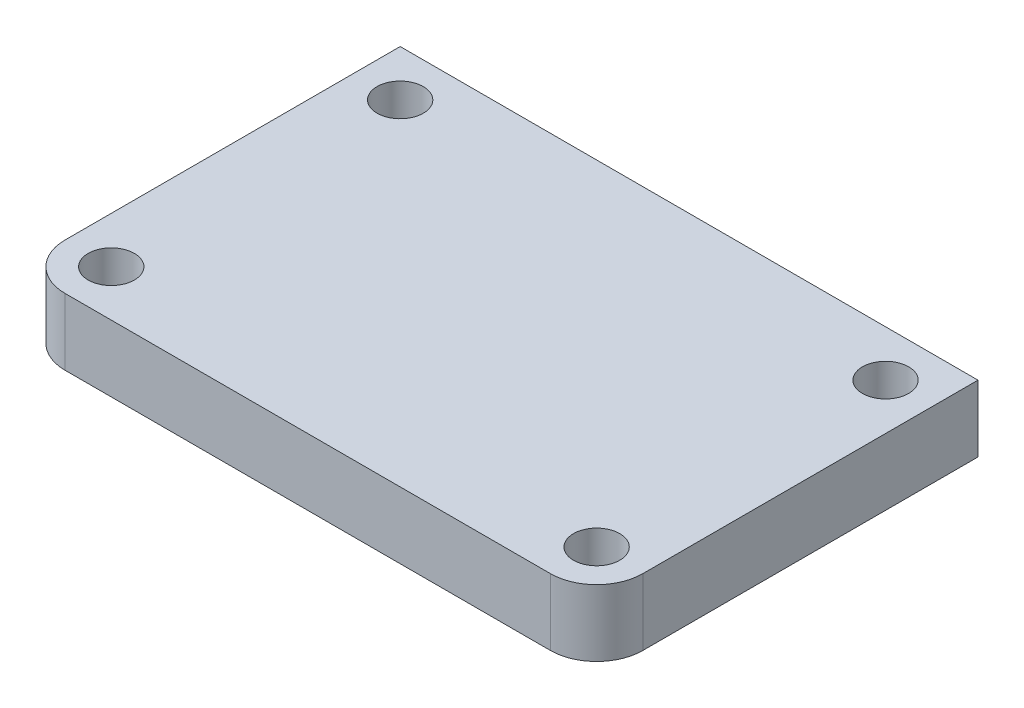
ISO-10303-21;
HEADER;
FILE_DESCRIPTION(('STEP AP214'),'2;1');
FILE_NAME('part.step','',(''),(''),'','','');
FILE_SCHEMA(('AUTOMOTIVE_DESIGN { 1 0 10303 214 1 1 1 1 }'));
ENDSEC;
DATA;
#1=APPLICATION_CONTEXT('core data for automotive mechanical design processes');
#2=APPLICATION_PROTOCOL_DEFINITION('international standard','automotive_design',2000,#1);
#3=PRODUCT_CONTEXT('',#1,'mechanical');
#4=PRODUCT('Part','Part','',(#3));
#5=PRODUCT_RELATED_PRODUCT_CATEGORY('part','',(#4));
#6=PRODUCT_DEFINITION_FORMATION('','',#4);
#7=PRODUCT_DEFINITION_CONTEXT('part definition',#1,'design');
#8=PRODUCT_DEFINITION('design','',#6,#7);
#9=PRODUCT_DEFINITION_SHAPE('','',#8);
#10=(LENGTH_UNIT() NAMED_UNIT(*) SI_UNIT(.MILLI.,.METRE.));
#11=(NAMED_UNIT(*) PLANE_ANGLE_UNIT() SI_UNIT($,.RADIAN.));
#12=(NAMED_UNIT(*) SI_UNIT($,.STERADIAN.) SOLID_ANGLE_UNIT());
#13=UNCERTAINTY_MEASURE_WITH_UNIT(LENGTH_MEASURE(1.E-05),#10,'distance_accuracy_value','');
#14=(GEOMETRIC_REPRESENTATION_CONTEXT(3) GLOBAL_UNCERTAINTY_ASSIGNED_CONTEXT((#13)) GLOBAL_UNIT_ASSIGNED_CONTEXT((#10,
#11,#12)) REPRESENTATION_CONTEXT('',''));
#15=CARTESIAN_POINT('',(0.,0.,0.));
#16=DIRECTION('',(0.,0.,1.));
#17=DIRECTION('',(1.,0.,0.));
#18=AXIS2_PLACEMENT_3D('',#15,#16,#17);
#19=CARTESIAN_POINT('',(0.,2.88,-4.5));
#20=DIRECTION('',(0.,0.,-1.));
#21=DIRECTION('',(-1.,0.,0.));
#22=AXIS2_PLACEMENT_3D('',#19,#20,#21);
#23=PLANE('',#22);
#24=DIRECTION('',(1.,0.,0.));
#25=VECTOR('',#24,1.);
#26=CARTESIAN_POINT('',(0.,0.,-4.5));
#27=LINE('',#26,#25);
#28=CARTESIAN_POINT('',(-12.5,0.,-4.5));
#29=VERTEX_POINT('',#28);
#30=CARTESIAN_POINT('',(12.5,0.,-4.5));
#31=VERTEX_POINT('',#30);
#32=EDGE_CURVE('E110',#29,#31,#27,.T.);
#33=ORIENTED_EDGE('',*,*,#32,.F.);
#34=DIRECTION('',(0.,-1.,0.));
#35=VECTOR('',#34,1.);
#36=CARTESIAN_POINT('',(-12.5,2.88,-4.5));
#37=LINE('',#36,#35);
#38=CARTESIAN_POINT('',(-12.5,2.88,-4.5));
#39=VERTEX_POINT('',#38);
#40=EDGE_CURVE('E97',#39,#29,#37,.T.);
#41=ORIENTED_EDGE('',*,*,#40,.F.);
#42=DIRECTION('',(1.,0.,0.));
#43=VECTOR('',#42,1.);
#44=CARTESIAN_POINT('',(0.,2.88,-4.5));
#45=LINE('',#44,#43);
#46=CARTESIAN_POINT('',(12.5,2.88,-4.5));
#47=VERTEX_POINT('',#46);
#48=EDGE_CURVE('E104',#39,#47,#45,.T.);
#49=ORIENTED_EDGE('',*,*,#48,.T.);
#50=DIRECTION('',(0.,-1.,0.));
#51=VECTOR('',#50,1.);
#52=CARTESIAN_POINT('',(12.5,2.88,-4.5));
#53=LINE('',#52,#51);
#54=EDGE_CURVE('E113',#47,#31,#53,.T.);
#55=ORIENTED_EDGE('',*,*,#54,.T.);
#56=EDGE_LOOP('',(#33,#41,#49,#55));
#57=FACE_BOUND('',#56,.T.);
#58=ADVANCED_FACE('F41',(#57),#23,.T.);
#59=CARTESIAN_POINT('',(-12.5,2.88,0.));
#60=DIRECTION('',(-1.,0.,0.));
#61=DIRECTION('',(0.,0.,1.));
#62=AXIS2_PLACEMENT_3D('',#59,#60,#61);
#63=PLANE('',#62);
#64=DIRECTION('',(0.,0.,-1.));
#65=VECTOR('',#64,1.);
#66=CARTESIAN_POINT('',(-12.5,0.,0.));
#67=LINE('',#66,#65);
#68=CARTESIAN_POINT('',(-12.5,0.,10.));
#69=VERTEX_POINT('',#68);
#70=EDGE_CURVE('E135',#69,#29,#67,.T.);
#71=ORIENTED_EDGE('',*,*,#70,.F.);
#72=DIRECTION('',(0.,-1.,0.));
#73=VECTOR('',#72,1.);
#74=CARTESIAN_POINT('',(-12.5,2.88,10.));
#75=LINE('',#74,#73);
#76=CARTESIAN_POINT('',(-12.5,2.88,10.));
#77=VERTEX_POINT('',#76);
#78=EDGE_CURVE('E11',#69,#77,#75,.F.);
#79=ORIENTED_EDGE('',*,*,#78,.T.);
#80=DIRECTION('',(0.,0.,-1.));
#81=VECTOR('',#80,1.);
#82=CARTESIAN_POINT('',(-12.5,2.88,0.));
#83=LINE('',#82,#81);
#84=EDGE_CURVE('E94',#77,#39,#83,.T.);
#85=ORIENTED_EDGE('',*,*,#84,.T.);
#86=ORIENTED_EDGE('',*,*,#40,.T.);
#87=EDGE_LOOP('',(#71,#79,#85,#86));
#88=FACE_BOUND('',#87,.T.);
#89=ADVANCED_FACE('F96',(#88),#63,.T.);
#90=CARTESIAN_POINT('',(0.,2.88,12.));
#91=DIRECTION('',(0.,0.,-1.));
#92=DIRECTION('',(-1.,0.,0.));
#93=AXIS2_PLACEMENT_3D('',#90,#91,#92);
#94=PLANE('',#93);
#95=DIRECTION('',(1.,0.,0.));
#96=VECTOR('',#95,1.);
#97=CARTESIAN_POINT('',(0.,0.,12.));
#98=LINE('',#97,#96);
#99=CARTESIAN_POINT('',(-10.5,0.,12.));
#100=VERTEX_POINT('',#99);
#101=CARTESIAN_POINT('',(10.5,0.,12.));
#102=VERTEX_POINT('',#101);
#103=EDGE_CURVE('E123',#100,#102,#98,.T.);
#104=ORIENTED_EDGE('',*,*,#103,.T.);
#105=DIRECTION('',(0.,-1.,0.));
#106=VECTOR('',#105,1.);
#107=CARTESIAN_POINT('',(10.5,2.88,12.));
#108=LINE('',#107,#106);
#109=CARTESIAN_POINT('',(10.5,2.88,12.));
#110=VERTEX_POINT('',#109);
#111=EDGE_CURVE('E63',#102,#110,#108,.F.);
#112=ORIENTED_EDGE('',*,*,#111,.T.);
#113=DIRECTION('',(1.,0.,0.));
#114=VECTOR('',#113,1.);
#115=CARTESIAN_POINT('',(0.,2.88,12.));
#116=LINE('',#115,#114);
#117=CARTESIAN_POINT('',(-10.5,2.88,12.));
#118=VERTEX_POINT('',#117);
#119=EDGE_CURVE('E103',#118,#110,#116,.T.);
#120=ORIENTED_EDGE('',*,*,#119,.F.);
#121=DIRECTION('',(0.,-1.,0.));
#122=VECTOR('',#121,1.);
#123=CARTESIAN_POINT('',(-10.5,0.,12.));
#124=LINE('',#123,#122);
#125=EDGE_CURVE('E152',#118,#100,#124,.T.);
#126=ORIENTED_EDGE('',*,*,#125,.T.);
#127=EDGE_LOOP('',(#104,#112,#120,#126));
#128=FACE_BOUND('',#127,.T.);
#129=ADVANCED_FACE('F171',(#128),#94,.F.);
#130=CARTESIAN_POINT('',(12.5,2.88,0.));
#131=DIRECTION('',(-1.,0.,0.));
#132=DIRECTION('',(0.,0.,1.));
#133=AXIS2_PLACEMENT_3D('',#130,#131,#132);
#134=PLANE('',#133);
#135=DIRECTION('',(0.,0.,-1.));
#136=VECTOR('',#135,1.);
#137=CARTESIAN_POINT('',(12.5,2.88,0.));
#138=LINE('',#137,#136);
#139=CARTESIAN_POINT('',(12.5,2.88,10.));
#140=VERTEX_POINT('',#139);
#141=EDGE_CURVE('E117',#140,#47,#138,.T.);
#142=ORIENTED_EDGE('',*,*,#141,.F.);
#143=DIRECTION('',(0.,-1.,0.));
#144=VECTOR('',#143,1.);
#145=CARTESIAN_POINT('',(12.5,2.88,10.));
#146=LINE('',#145,#144);
#147=CARTESIAN_POINT('',(12.5,0.,10.));
#148=VERTEX_POINT('',#147);
#149=EDGE_CURVE('E112',#140,#148,#146,.T.);
#150=ORIENTED_EDGE('',*,*,#149,.T.);
#151=DIRECTION('',(0.,0.,-1.));
#152=VECTOR('',#151,1.);
#153=CARTESIAN_POINT('',(12.5,0.,0.));
#154=LINE('',#153,#152);
#155=EDGE_CURVE('E120',#148,#31,#154,.T.);
#156=ORIENTED_EDGE('',*,*,#155,.T.);
#157=ORIENTED_EDGE('',*,*,#54,.F.);
#158=EDGE_LOOP('',(#142,#150,#156,#157));
#159=FACE_BOUND('',#158,.T.);
#160=ADVANCED_FACE('F165',(#159),#134,.F.);
#161=CARTESIAN_POINT('',(0.,2.88,0.));
#162=DIRECTION('',(0.,1.,0.));
#163=DIRECTION('',(0.,0.,1.));
#164=AXIS2_PLACEMENT_3D('',#161,#162,#163);
#165=PLANE('',#164);
#166=CARTESIAN_POINT('',(10.5,2.88,-2.5));
#167=DIRECTION('',(0.,1.,0.));
#168=DIRECTION('',(0.,0.,1.));
#169=AXIS2_PLACEMENT_3D('',#166,#167,#168);
#170=CIRCLE('',#169,1.);
#171=CARTESIAN_POINT('',(10.5,2.88,-1.5));
#172=VERTEX_POINT('',#171);
#173=EDGE_CURVE('E237',#172,#172,#170,.T.);
#174=ORIENTED_EDGE('',*,*,#173,.F.);
#175=EDGE_LOOP('',(#174));
#176=FACE_BOUND('',#175,.T.);
#177=CARTESIAN_POINT('',(10.5,2.88,10.));
#178=DIRECTION('',(0.,1.,0.));
#179=DIRECTION('',(0.,0.,1.));
#180=AXIS2_PLACEMENT_3D('',#177,#178,#179);
#181=CIRCLE('',#180,1.);
#182=CARTESIAN_POINT('',(10.5,2.88,11.));
#183=VERTEX_POINT('',#182);
#184=EDGE_CURVE('E227',#183,#183,#181,.T.);
#185=ORIENTED_EDGE('',*,*,#184,.F.);
#186=EDGE_LOOP('',(#185));
#187=FACE_BOUND('',#186,.T.);
#188=CARTESIAN_POINT('',(-10.5,2.88,10.));
#189=DIRECTION('',(0.,1.,0.));
#190=DIRECTION('',(0.,0.,1.));
#191=AXIS2_PLACEMENT_3D('',#188,#189,#190);
#192=CIRCLE('',#191,1.);
#193=CARTESIAN_POINT('',(-10.5,2.88,11.));
#194=VERTEX_POINT('',#193);
#195=EDGE_CURVE('E218',#194,#194,#192,.T.);
#196=ORIENTED_EDGE('',*,*,#195,.F.);
#197=EDGE_LOOP('',(#196));
#198=FACE_BOUND('',#197,.T.);
#199=CARTESIAN_POINT('',(-10.5,2.88,-2.5));
#200=DIRECTION('',(0.,1.,0.));
#201=DIRECTION('',(0.,0.,1.));
#202=AXIS2_PLACEMENT_3D('',#199,#200,#201);
#203=CIRCLE('',#202,1.);
#204=CARTESIAN_POINT('',(-10.5,2.88,-1.5));
#205=VERTEX_POINT('',#204);
#206=EDGE_CURVE('E126',#205,#205,#203,.T.);
#207=ORIENTED_EDGE('',*,*,#206,.F.);
#208=EDGE_LOOP('',(#207));
#209=FACE_BOUND('',#208,.T.);
#210=ORIENTED_EDGE('',*,*,#119,.T.);
#211=CARTESIAN_POINT('',(10.5,2.88,10.));
#212=DIRECTION('',(0.,1.,0.));
#213=DIRECTION('',(0.,0.,1.));
#214=AXIS2_PLACEMENT_3D('',#211,#212,#213);
#215=CIRCLE('',#214,2.);
#216=EDGE_CURVE('E50',#110,#140,#215,.T.);
#217=ORIENTED_EDGE('',*,*,#216,.T.);
#218=ORIENTED_EDGE('',*,*,#141,.T.);
#219=ORIENTED_EDGE('',*,*,#48,.F.);
#220=ORIENTED_EDGE('',*,*,#84,.F.);
#221=CARTESIAN_POINT('',(-10.5,2.88,10.));
#222=DIRECTION('',(0.,1.,0.));
#223=DIRECTION('',(0.,0.,1.));
#224=AXIS2_PLACEMENT_3D('',#221,#222,#223);
#225=CIRCLE('',#224,2.);
#226=EDGE_CURVE('E158',#77,#118,#225,.T.);
#227=ORIENTED_EDGE('',*,*,#226,.T.);
#228=EDGE_LOOP('',(#210,#217,#218,#219,#220,#227));
#229=FACE_BOUND('',#228,.T.);
#230=ADVANCED_FACE('F115',(#176,#187,#198,#209,#229),#165,.T.);
#231=CARTESIAN_POINT('',(0.,0.,0.));
#232=DIRECTION('',(0.,1.,0.));
#233=DIRECTION('',(0.,0.,1.));
#234=AXIS2_PLACEMENT_3D('',#231,#232,#233);
#235=PLANE('',#234);
#236=CARTESIAN_POINT('',(10.5,0.,-2.5));
#237=DIRECTION('',(0.,1.,0.));
#238=DIRECTION('',(0.,0.,1.));
#239=AXIS2_PLACEMENT_3D('',#236,#237,#238);
#240=CIRCLE('',#239,1.);
#241=CARTESIAN_POINT('',(10.5,0.,-1.5));
#242=VERTEX_POINT('',#241);
#243=EDGE_CURVE('E233',#242,#242,#240,.T.);
#244=ORIENTED_EDGE('',*,*,#243,.T.);
#245=EDGE_LOOP('',(#244));
#246=FACE_BOUND('',#245,.T.);
#247=CARTESIAN_POINT('',(10.5,0.,10.));
#248=DIRECTION('',(0.,1.,0.));
#249=DIRECTION('',(0.,0.,1.));
#250=AXIS2_PLACEMENT_3D('',#247,#248,#249);
#251=CIRCLE('',#250,1.);
#252=CARTESIAN_POINT('',(10.5,0.,11.));
#253=VERTEX_POINT('',#252);
#254=EDGE_CURVE('E221',#253,#253,#251,.T.);
#255=ORIENTED_EDGE('',*,*,#254,.T.);
#256=EDGE_LOOP('',(#255));
#257=FACE_BOUND('',#256,.T.);
#258=CARTESIAN_POINT('',(-10.5,0.,10.));
#259=DIRECTION('',(0.,1.,0.));
#260=DIRECTION('',(0.,0.,1.));
#261=AXIS2_PLACEMENT_3D('',#258,#259,#260);
#262=CIRCLE('',#261,1.);
#263=CARTESIAN_POINT('',(-10.5,0.,11.));
#264=VERTEX_POINT('',#263);
#265=EDGE_CURVE('E215',#264,#264,#262,.T.);
#266=ORIENTED_EDGE('',*,*,#265,.T.);
#267=EDGE_LOOP('',(#266));
#268=FACE_BOUND('',#267,.T.);
#269=CARTESIAN_POINT('',(-10.5,0.,-2.5));
#270=DIRECTION('',(0.,1.,0.));
#271=DIRECTION('',(0.,0.,1.));
#272=AXIS2_PLACEMENT_3D('',#269,#270,#271);
#273=CIRCLE('',#272,1.);
#274=CARTESIAN_POINT('',(-10.5,0.,-1.5));
#275=VERTEX_POINT('',#274);
#276=EDGE_CURVE('E136',#275,#275,#273,.T.);
#277=ORIENTED_EDGE('',*,*,#276,.T.);
#278=EDGE_LOOP('',(#277));
#279=FACE_BOUND('',#278,.T.);
#280=ORIENTED_EDGE('',*,*,#155,.F.);
#281=CARTESIAN_POINT('',(10.5,0.,10.));
#282=DIRECTION('',(0.,1.,0.));
#283=DIRECTION('',(0.,0.,1.));
#284=AXIS2_PLACEMENT_3D('',#281,#282,#283);
#285=CIRCLE('',#284,2.);
#286=EDGE_CURVE('E149',#148,#102,#285,.F.);
#287=ORIENTED_EDGE('',*,*,#286,.T.);
#288=ORIENTED_EDGE('',*,*,#103,.F.);
#289=CARTESIAN_POINT('',(-10.5,0.,10.));
#290=DIRECTION('',(0.,1.,0.));
#291=DIRECTION('',(0.,0.,1.));
#292=AXIS2_PLACEMENT_3D('',#289,#290,#291);
#293=CIRCLE('',#292,2.);
#294=EDGE_CURVE('E146',#100,#69,#293,.F.);
#295=ORIENTED_EDGE('',*,*,#294,.T.);
#296=ORIENTED_EDGE('',*,*,#70,.T.);
#297=ORIENTED_EDGE('',*,*,#32,.T.);
#298=EDGE_LOOP('',(#280,#287,#288,#295,#296,#297));
#299=FACE_BOUND('',#298,.T.);
#300=ADVANCED_FACE('F170',(#246,#257,#268,#279,#299),#235,.F.);
#301=CARTESIAN_POINT('',(-10.5,0.,-2.5));
#302=DIRECTION('',(0.,1.,0.));
#303=DIRECTION('',(0.,0.,1.));
#304=AXIS2_PLACEMENT_3D('',#301,#302,#303);
#305=CYLINDRICAL_SURFACE('',#304,1.);
#306=CARTESIAN_POINT('',(-10.5,0.,-1.5));
#307=CARTESIAN_POINT('',(-10.5,0.0299999999999999,-1.5));
#308=CARTESIAN_POINT('',(-10.5,0.06,-1.5));
#309=CARTESIAN_POINT('',(-10.5,0.12,-1.5));
#310=CARTESIAN_POINT('',(-10.5,0.15,-1.5));
#311=CARTESIAN_POINT('',(-10.5,0.21,-1.5));
#312=CARTESIAN_POINT('',(-10.5,0.24,-1.5));
#313=CARTESIAN_POINT('',(-10.5,0.3,-1.5));
#314=CARTESIAN_POINT('',(-10.5,0.33,-1.5));
#315=CARTESIAN_POINT('',(-10.5,0.39,-1.5));
#316=CARTESIAN_POINT('',(-10.5,0.42,-1.5));
#317=CARTESIAN_POINT('',(-10.5,0.48,-1.5));
#318=CARTESIAN_POINT('',(-10.5,0.51,-1.5));
#319=CARTESIAN_POINT('',(-10.5,0.57,-1.5));
#320=CARTESIAN_POINT('',(-10.5,0.6,-1.5));
#321=CARTESIAN_POINT('',(-10.5,0.66,-1.5));
#322=CARTESIAN_POINT('',(-10.5,0.69,-1.5));
#323=CARTESIAN_POINT('',(-10.5,0.75,-1.5));
#324=CARTESIAN_POINT('',(-10.5,0.78,-1.5));
#325=CARTESIAN_POINT('',(-10.5,0.84,-1.5));
#326=CARTESIAN_POINT('',(-10.5,0.87,-1.5));
#327=CARTESIAN_POINT('',(-10.5,0.93,-1.5));
#328=CARTESIAN_POINT('',(-10.5,0.96,-1.5));
#329=CARTESIAN_POINT('',(-10.5,1.02,-1.5));
#330=CARTESIAN_POINT('',(-10.5,1.05,-1.5));
#331=CARTESIAN_POINT('',(-10.5,1.11,-1.5));
#332=CARTESIAN_POINT('',(-10.5,1.14,-1.5));
#333=CARTESIAN_POINT('',(-10.5,1.2,-1.5));
#334=CARTESIAN_POINT('',(-10.5,1.23,-1.5));
#335=CARTESIAN_POINT('',(-10.5,1.29,-1.5));
#336=CARTESIAN_POINT('',(-10.5,1.32,-1.5));
#337=CARTESIAN_POINT('',(-10.5,1.38,-1.5));
#338=CARTESIAN_POINT('',(-10.5,1.41,-1.5));
#339=CARTESIAN_POINT('',(-10.5,1.47,-1.5));
#340=CARTESIAN_POINT('',(-10.5,1.5,-1.5));
#341=CARTESIAN_POINT('',(-10.5,1.56,-1.5));
#342=CARTESIAN_POINT('',(-10.5,1.59,-1.5));
#343=CARTESIAN_POINT('',(-10.5,1.65,-1.5));
#344=CARTESIAN_POINT('',(-10.5,1.68,-1.5));
#345=CARTESIAN_POINT('',(-10.5,1.74,-1.5));
#346=CARTESIAN_POINT('',(-10.5,1.77,-1.5));
#347=CARTESIAN_POINT('',(-10.5,1.83,-1.5));
#348=CARTESIAN_POINT('',(-10.5,1.86,-1.5));
#349=CARTESIAN_POINT('',(-10.5,1.92,-1.5));
#350=CARTESIAN_POINT('',(-10.5,1.95,-1.5));
#351=CARTESIAN_POINT('',(-10.5,2.01,-1.5));
#352=CARTESIAN_POINT('',(-10.5,2.04,-1.5));
#353=CARTESIAN_POINT('',(-10.5,2.1,-1.5));
#354=CARTESIAN_POINT('',(-10.5,2.13,-1.5));
#355=CARTESIAN_POINT('',(-10.5,2.19,-1.5));
#356=CARTESIAN_POINT('',(-10.5,2.22,-1.5));
#357=CARTESIAN_POINT('',(-10.5,2.28,-1.5));
#358=CARTESIAN_POINT('',(-10.5,2.31,-1.5));
#359=CARTESIAN_POINT('',(-10.5,2.37,-1.5));
#360=CARTESIAN_POINT('',(-10.5,2.4,-1.5));
#361=CARTESIAN_POINT('',(-10.5,2.46,-1.5));
#362=CARTESIAN_POINT('',(-10.5,2.49,-1.5));
#363=CARTESIAN_POINT('',(-10.5,2.55,-1.5));
#364=CARTESIAN_POINT('',(-10.5,2.58,-1.5));
#365=CARTESIAN_POINT('',(-10.5,2.64,-1.5));
#366=CARTESIAN_POINT('',(-10.5,2.67,-1.5));
#367=CARTESIAN_POINT('',(-10.5,2.73,-1.5));
#368=CARTESIAN_POINT('',(-10.5,2.76,-1.5));
#369=CARTESIAN_POINT('',(-10.5,2.82,-1.5));
#370=CARTESIAN_POINT('',(-10.5,2.85,-1.5));
#371=CARTESIAN_POINT('',(-10.5,2.88,-1.5));
#372=B_SPLINE_CURVE_WITH_KNOTS('',3,(#306,#307,#308,#309,#310,#311,#312,#313,#314,#315,#316,
#317,#318,#319,#320,#321,#322,#323,#324,#325,#326,#327,#328,#329,#330,#331,#332,#333,#334,#335,
#336,#337,#338,#339,#340,#341,#342,#343,#344,#345,#346,#347,#348,#349,#350,#351,#352,#353,#354,
#355,#356,#357,#358,#359,#360,#361,#362,#363,#364,#365,#366,#367,#368,#369,#370,#371),
.UNSPECIFIED.,.F.,.F.,(4,2,2,2,2,2,2,2,2,2,2,2,2,2,2,2,2,2,2,2,2,2,2,2,2,2,2,2,2,2,2,2,4),(0.,
0.09,0.18,0.27,0.36,0.45,0.54,0.63,0.72,0.81,0.9,0.99,1.08,1.17,1.26,1.35,1.44,1.53,1.62,1.71,
1.8,1.89,1.98,2.07,2.16,2.25,2.34,2.43,2.52,2.61,2.7,2.79,2.88),.UNSPECIFIED.);
#373=EDGE_CURVE('BSEAM192',#275,#205,#372,.T.);
#374=ORIENTED_EDGE('',*,*,#276,.F.);
#375=ORIENTED_EDGE('',*,*,#206,.T.);
#376=ORIENTED_EDGE('',*,*,#373,.T.);
#377=ORIENTED_EDGE('',*,*,#373,.F.);
#378=EDGE_LOOP('',(#374,#376,#375,#377));
#379=FACE_BOUND('',#378,.T.);
#380=ADVANCED_FACE('F192',(#379),#305,.F.);
#381=CARTESIAN_POINT('',(-10.5,0.,10.));
#382=DIRECTION('',(0.,1.,0.));
#383=DIRECTION('',(0.,0.,1.));
#384=AXIS2_PLACEMENT_3D('',#381,#382,#383);
#385=CYLINDRICAL_SURFACE('',#384,1.);
#386=CARTESIAN_POINT('',(-10.5,0.,11.));
#387=CARTESIAN_POINT('',(-10.5,0.0299999999999999,11.));
#388=CARTESIAN_POINT('',(-10.5,0.06,11.));
#389=CARTESIAN_POINT('',(-10.5,0.12,11.));
#390=CARTESIAN_POINT('',(-10.5,0.15,11.));
#391=CARTESIAN_POINT('',(-10.5,0.21,11.));
#392=CARTESIAN_POINT('',(-10.5,0.24,11.));
#393=CARTESIAN_POINT('',(-10.5,0.3,11.));
#394=CARTESIAN_POINT('',(-10.5,0.33,11.));
#395=CARTESIAN_POINT('',(-10.5,0.39,11.));
#396=CARTESIAN_POINT('',(-10.5,0.42,11.));
#397=CARTESIAN_POINT('',(-10.5,0.48,11.));
#398=CARTESIAN_POINT('',(-10.5,0.51,11.));
#399=CARTESIAN_POINT('',(-10.5,0.57,11.));
#400=CARTESIAN_POINT('',(-10.5,0.6,11.));
#401=CARTESIAN_POINT('',(-10.5,0.66,11.));
#402=CARTESIAN_POINT('',(-10.5,0.69,11.));
#403=CARTESIAN_POINT('',(-10.5,0.75,11.));
#404=CARTESIAN_POINT('',(-10.5,0.78,11.));
#405=CARTESIAN_POINT('',(-10.5,0.84,11.));
#406=CARTESIAN_POINT('',(-10.5,0.87,11.));
#407=CARTESIAN_POINT('',(-10.5,0.93,11.));
#408=CARTESIAN_POINT('',(-10.5,0.96,11.));
#409=CARTESIAN_POINT('',(-10.5,1.02,11.));
#410=CARTESIAN_POINT('',(-10.5,1.05,11.));
#411=CARTESIAN_POINT('',(-10.5,1.11,11.));
#412=CARTESIAN_POINT('',(-10.5,1.14,11.));
#413=CARTESIAN_POINT('',(-10.5,1.2,11.));
#414=CARTESIAN_POINT('',(-10.5,1.23,11.));
#415=CARTESIAN_POINT('',(-10.5,1.29,11.));
#416=CARTESIAN_POINT('',(-10.5,1.32,11.));
#417=CARTESIAN_POINT('',(-10.5,1.38,11.));
#418=CARTESIAN_POINT('',(-10.5,1.41,11.));
#419=CARTESIAN_POINT('',(-10.5,1.47,11.));
#420=CARTESIAN_POINT('',(-10.5,1.5,11.));
#421=CARTESIAN_POINT('',(-10.5,1.56,11.));
#422=CARTESIAN_POINT('',(-10.5,1.59,11.));
#423=CARTESIAN_POINT('',(-10.5,1.65,11.));
#424=CARTESIAN_POINT('',(-10.5,1.68,11.));
#425=CARTESIAN_POINT('',(-10.5,1.74,11.));
#426=CARTESIAN_POINT('',(-10.5,1.77,11.));
#427=CARTESIAN_POINT('',(-10.5,1.83,11.));
#428=CARTESIAN_POINT('',(-10.5,1.86,11.));
#429=CARTESIAN_POINT('',(-10.5,1.92,11.));
#430=CARTESIAN_POINT('',(-10.5,1.95,11.));
#431=CARTESIAN_POINT('',(-10.5,2.01,11.));
#432=CARTESIAN_POINT('',(-10.5,2.04,11.));
#433=CARTESIAN_POINT('',(-10.5,2.1,11.));
#434=CARTESIAN_POINT('',(-10.5,2.13,11.));
#435=CARTESIAN_POINT('',(-10.5,2.19,11.));
#436=CARTESIAN_POINT('',(-10.5,2.22,11.));
#437=CARTESIAN_POINT('',(-10.5,2.28,11.));
#438=CARTESIAN_POINT('',(-10.5,2.31,11.));
#439=CARTESIAN_POINT('',(-10.5,2.37,11.));
#440=CARTESIAN_POINT('',(-10.5,2.4,11.));
#441=CARTESIAN_POINT('',(-10.5,2.46,11.));
#442=CARTESIAN_POINT('',(-10.5,2.49,11.));
#443=CARTESIAN_POINT('',(-10.5,2.55,11.));
#444=CARTESIAN_POINT('',(-10.5,2.58,11.));
#445=CARTESIAN_POINT('',(-10.5,2.64,11.));
#446=CARTESIAN_POINT('',(-10.5,2.67,11.));
#447=CARTESIAN_POINT('',(-10.5,2.73,11.));
#448=CARTESIAN_POINT('',(-10.5,2.76,11.));
#449=CARTESIAN_POINT('',(-10.5,2.82,11.));
#450=CARTESIAN_POINT('',(-10.5,2.85,11.));
#451=CARTESIAN_POINT('',(-10.5,2.88,11.));
#452=B_SPLINE_CURVE_WITH_KNOTS('',3,(#386,#387,#388,#389,#390,#391,#392,#393,#394,#395,#396,
#397,#398,#399,#400,#401,#402,#403,#404,#405,#406,#407,#408,#409,#410,#411,#412,#413,#414,#415,
#416,#417,#418,#419,#420,#421,#422,#423,#424,#425,#426,#427,#428,#429,#430,#431,#432,#433,#434,
#435,#436,#437,#438,#439,#440,#441,#442,#443,#444,#445,#446,#447,#448,#449,#450,#451),
.UNSPECIFIED.,.F.,.F.,(4,2,2,2,2,2,2,2,2,2,2,2,2,2,2,2,2,2,2,2,2,2,2,2,2,2,2,2,2,2,2,2,4),(0.,
0.09,0.18,0.27,0.36,0.45,0.54,0.63,0.72,0.81,0.9,0.99,1.08,1.17,1.26,1.35,1.44,1.53,1.62,1.71,
1.8,1.89,1.98,2.07,2.16,2.25,2.34,2.43,2.52,2.61,2.7,2.79,2.88),.UNSPECIFIED.);
#453=EDGE_CURVE('BSEAM199',#264,#194,#452,.T.);
#454=ORIENTED_EDGE('',*,*,#265,.F.);
#455=ORIENTED_EDGE('',*,*,#195,.T.);
#456=ORIENTED_EDGE('',*,*,#453,.T.);
#457=ORIENTED_EDGE('',*,*,#453,.F.);
#458=EDGE_LOOP('',(#454,#456,#455,#457));
#459=FACE_BOUND('',#458,.T.);
#460=ADVANCED_FACE('F199',(#459),#385,.F.);
#461=CARTESIAN_POINT('',(10.5,0.,10.));
#462=DIRECTION('',(0.,1.,0.));
#463=DIRECTION('',(0.,0.,1.));
#464=AXIS2_PLACEMENT_3D('',#461,#462,#463);
#465=CYLINDRICAL_SURFACE('',#464,1.);
#466=CARTESIAN_POINT('',(10.5,0.,11.));
#467=CARTESIAN_POINT('',(10.5,0.0299999999999999,11.));
#468=CARTESIAN_POINT('',(10.5,0.06,11.));
#469=CARTESIAN_POINT('',(10.5,0.12,11.));
#470=CARTESIAN_POINT('',(10.5,0.15,11.));
#471=CARTESIAN_POINT('',(10.5,0.21,11.));
#472=CARTESIAN_POINT('',(10.5,0.24,11.));
#473=CARTESIAN_POINT('',(10.5,0.3,11.));
#474=CARTESIAN_POINT('',(10.5,0.33,11.));
#475=CARTESIAN_POINT('',(10.5,0.39,11.));
#476=CARTESIAN_POINT('',(10.5,0.42,11.));
#477=CARTESIAN_POINT('',(10.5,0.48,11.));
#478=CARTESIAN_POINT('',(10.5,0.51,11.));
#479=CARTESIAN_POINT('',(10.5,0.57,11.));
#480=CARTESIAN_POINT('',(10.5,0.6,11.));
#481=CARTESIAN_POINT('',(10.5,0.66,11.));
#482=CARTESIAN_POINT('',(10.5,0.69,11.));
#483=CARTESIAN_POINT('',(10.5,0.75,11.));
#484=CARTESIAN_POINT('',(10.5,0.78,11.));
#485=CARTESIAN_POINT('',(10.5,0.84,11.));
#486=CARTESIAN_POINT('',(10.5,0.87,11.));
#487=CARTESIAN_POINT('',(10.5,0.93,11.));
#488=CARTESIAN_POINT('',(10.5,0.96,11.));
#489=CARTESIAN_POINT('',(10.5,1.02,11.));
#490=CARTESIAN_POINT('',(10.5,1.05,11.));
#491=CARTESIAN_POINT('',(10.5,1.11,11.));
#492=CARTESIAN_POINT('',(10.5,1.14,11.));
#493=CARTESIAN_POINT('',(10.5,1.2,11.));
#494=CARTESIAN_POINT('',(10.5,1.23,11.));
#495=CARTESIAN_POINT('',(10.5,1.29,11.));
#496=CARTESIAN_POINT('',(10.5,1.32,11.));
#497=CARTESIAN_POINT('',(10.5,1.38,11.));
#498=CARTESIAN_POINT('',(10.5,1.41,11.));
#499=CARTESIAN_POINT('',(10.5,1.47,11.));
#500=CARTESIAN_POINT('',(10.5,1.5,11.));
#501=CARTESIAN_POINT('',(10.5,1.56,11.));
#502=CARTESIAN_POINT('',(10.5,1.59,11.));
#503=CARTESIAN_POINT('',(10.5,1.65,11.));
#504=CARTESIAN_POINT('',(10.5,1.68,11.));
#505=CARTESIAN_POINT('',(10.5,1.74,11.));
#506=CARTESIAN_POINT('',(10.5,1.77,11.));
#507=CARTESIAN_POINT('',(10.5,1.83,11.));
#508=CARTESIAN_POINT('',(10.5,1.86,11.));
#509=CARTESIAN_POINT('',(10.5,1.92,11.));
#510=CARTESIAN_POINT('',(10.5,1.95,11.));
#511=CARTESIAN_POINT('',(10.5,2.01,11.));
#512=CARTESIAN_POINT('',(10.5,2.04,11.));
#513=CARTESIAN_POINT('',(10.5,2.1,11.));
#514=CARTESIAN_POINT('',(10.5,2.13,11.));
#515=CARTESIAN_POINT('',(10.5,2.19,11.));
#516=CARTESIAN_POINT('',(10.5,2.22,11.));
#517=CARTESIAN_POINT('',(10.5,2.28,11.));
#518=CARTESIAN_POINT('',(10.5,2.31,11.));
#519=CARTESIAN_POINT('',(10.5,2.37,11.));
#520=CARTESIAN_POINT('',(10.5,2.4,11.));
#521=CARTESIAN_POINT('',(10.5,2.46,11.));
#522=CARTESIAN_POINT('',(10.5,2.49,11.));
#523=CARTESIAN_POINT('',(10.5,2.55,11.));
#524=CARTESIAN_POINT('',(10.5,2.58,11.));
#525=CARTESIAN_POINT('',(10.5,2.64,11.));
#526=CARTESIAN_POINT('',(10.5,2.67,11.));
#527=CARTESIAN_POINT('',(10.5,2.73,11.));
#528=CARTESIAN_POINT('',(10.5,2.76,11.));
#529=CARTESIAN_POINT('',(10.5,2.82,11.));
#530=CARTESIAN_POINT('',(10.5,2.85,11.));
#531=CARTESIAN_POINT('',(10.5,2.88,11.));
#532=B_SPLINE_CURVE_WITH_KNOTS('',3,(#466,#467,#468,#469,#470,#471,#472,#473,#474,#475,#476,
#477,#478,#479,#480,#481,#482,#483,#484,#485,#486,#487,#488,#489,#490,#491,#492,#493,#494,#495,
#496,#497,#498,#499,#500,#501,#502,#503,#504,#505,#506,#507,#508,#509,#510,#511,#512,#513,#514,
#515,#516,#517,#518,#519,#520,#521,#522,#523,#524,#525,#526,#527,#528,#529,#530,#531),
.UNSPECIFIED.,.F.,.F.,(4,2,2,2,2,2,2,2,2,2,2,2,2,2,2,2,2,2,2,2,2,2,2,2,2,2,2,2,2,2,2,2,4),(0.,
0.09,0.18,0.27,0.36,0.45,0.54,0.63,0.72,0.81,0.9,0.99,1.08,1.17,1.26,1.35,1.44,1.53,1.62,1.71,
1.8,1.89,1.98,2.07,2.16,2.25,2.34,2.43,2.52,2.61,2.7,2.79,2.88),.UNSPECIFIED.);
#533=EDGE_CURVE('BSEAM203',#253,#183,#532,.T.);
#534=ORIENTED_EDGE('',*,*,#254,.F.);
#535=ORIENTED_EDGE('',*,*,#184,.T.);
#536=ORIENTED_EDGE('',*,*,#533,.T.);
#537=ORIENTED_EDGE('',*,*,#533,.F.);
#538=EDGE_LOOP('',(#534,#536,#535,#537));
#539=FACE_BOUND('',#538,.T.);
#540=ADVANCED_FACE('F203',(#539),#465,.F.);
#541=CARTESIAN_POINT('',(10.5,0.,-2.5));
#542=DIRECTION('',(0.,1.,0.));
#543=DIRECTION('',(0.,0.,1.));
#544=AXIS2_PLACEMENT_3D('',#541,#542,#543);
#545=CYLINDRICAL_SURFACE('',#544,1.);
#546=CARTESIAN_POINT('',(10.5,0.,-1.5));
#547=CARTESIAN_POINT('',(10.5,0.0299999999999999,-1.5));
#548=CARTESIAN_POINT('',(10.5,0.06,-1.5));
#549=CARTESIAN_POINT('',(10.5,0.12,-1.5));
#550=CARTESIAN_POINT('',(10.5,0.15,-1.5));
#551=CARTESIAN_POINT('',(10.5,0.21,-1.5));
#552=CARTESIAN_POINT('',(10.5,0.24,-1.5));
#553=CARTESIAN_POINT('',(10.5,0.3,-1.5));
#554=CARTESIAN_POINT('',(10.5,0.33,-1.5));
#555=CARTESIAN_POINT('',(10.5,0.39,-1.5));
#556=CARTESIAN_POINT('',(10.5,0.42,-1.5));
#557=CARTESIAN_POINT('',(10.5,0.48,-1.5));
#558=CARTESIAN_POINT('',(10.5,0.51,-1.5));
#559=CARTESIAN_POINT('',(10.5,0.57,-1.5));
#560=CARTESIAN_POINT('',(10.5,0.6,-1.5));
#561=CARTESIAN_POINT('',(10.5,0.66,-1.5));
#562=CARTESIAN_POINT('',(10.5,0.69,-1.5));
#563=CARTESIAN_POINT('',(10.5,0.75,-1.5));
#564=CARTESIAN_POINT('',(10.5,0.78,-1.5));
#565=CARTESIAN_POINT('',(10.5,0.84,-1.5));
#566=CARTESIAN_POINT('',(10.5,0.87,-1.5));
#567=CARTESIAN_POINT('',(10.5,0.93,-1.5));
#568=CARTESIAN_POINT('',(10.5,0.96,-1.5));
#569=CARTESIAN_POINT('',(10.5,1.02,-1.5));
#570=CARTESIAN_POINT('',(10.5,1.05,-1.5));
#571=CARTESIAN_POINT('',(10.5,1.11,-1.5));
#572=CARTESIAN_POINT('',(10.5,1.14,-1.5));
#573=CARTESIAN_POINT('',(10.5,1.2,-1.5));
#574=CARTESIAN_POINT('',(10.5,1.23,-1.5));
#575=CARTESIAN_POINT('',(10.5,1.29,-1.5));
#576=CARTESIAN_POINT('',(10.5,1.32,-1.5));
#577=CARTESIAN_POINT('',(10.5,1.38,-1.5));
#578=CARTESIAN_POINT('',(10.5,1.41,-1.5));
#579=CARTESIAN_POINT('',(10.5,1.47,-1.5));
#580=CARTESIAN_POINT('',(10.5,1.5,-1.5));
#581=CARTESIAN_POINT('',(10.5,1.56,-1.5));
#582=CARTESIAN_POINT('',(10.5,1.59,-1.5));
#583=CARTESIAN_POINT('',(10.5,1.65,-1.5));
#584=CARTESIAN_POINT('',(10.5,1.68,-1.5));
#585=CARTESIAN_POINT('',(10.5,1.74,-1.5));
#586=CARTESIAN_POINT('',(10.5,1.77,-1.5));
#587=CARTESIAN_POINT('',(10.5,1.83,-1.5));
#588=CARTESIAN_POINT('',(10.5,1.86,-1.5));
#589=CARTESIAN_POINT('',(10.5,1.92,-1.5));
#590=CARTESIAN_POINT('',(10.5,1.95,-1.5));
#591=CARTESIAN_POINT('',(10.5,2.01,-1.5));
#592=CARTESIAN_POINT('',(10.5,2.04,-1.5));
#593=CARTESIAN_POINT('',(10.5,2.1,-1.5));
#594=CARTESIAN_POINT('',(10.5,2.13,-1.5));
#595=CARTESIAN_POINT('',(10.5,2.19,-1.5));
#596=CARTESIAN_POINT('',(10.5,2.22,-1.5));
#597=CARTESIAN_POINT('',(10.5,2.28,-1.5));
#598=CARTESIAN_POINT('',(10.5,2.31,-1.5));
#599=CARTESIAN_POINT('',(10.5,2.37,-1.5));
#600=CARTESIAN_POINT('',(10.5,2.4,-1.5));
#601=CARTESIAN_POINT('',(10.5,2.46,-1.5));
#602=CARTESIAN_POINT('',(10.5,2.49,-1.5));
#603=CARTESIAN_POINT('',(10.5,2.55,-1.5));
#604=CARTESIAN_POINT('',(10.5,2.58,-1.5));
#605=CARTESIAN_POINT('',(10.5,2.64,-1.5));
#606=CARTESIAN_POINT('',(10.5,2.67,-1.5));
#607=CARTESIAN_POINT('',(10.5,2.73,-1.5));
#608=CARTESIAN_POINT('',(10.5,2.76,-1.5));
#609=CARTESIAN_POINT('',(10.5,2.82,-1.5));
#610=CARTESIAN_POINT('',(10.5,2.85,-1.5));
#611=CARTESIAN_POINT('',(10.5,2.88,-1.5));
#612=B_SPLINE_CURVE_WITH_KNOTS('',3,(#546,#547,#548,#549,#550,#551,#552,#553,#554,#555,#556,
#557,#558,#559,#560,#561,#562,#563,#564,#565,#566,#567,#568,#569,#570,#571,#572,#573,#574,#575,
#576,#577,#578,#579,#580,#581,#582,#583,#584,#585,#586,#587,#588,#589,#590,#591,#592,#593,#594,
#595,#596,#597,#598,#599,#600,#601,#602,#603,#604,#605,#606,#607,#608,#609,#610,#611),
.UNSPECIFIED.,.F.,.F.,(4,2,2,2,2,2,2,2,2,2,2,2,2,2,2,2,2,2,2,2,2,2,2,2,2,2,2,2,2,2,2,2,4),(0.,
0.09,0.18,0.27,0.36,0.45,0.54,0.63,0.72,0.81,0.9,0.99,1.08,1.17,1.26,1.35,1.44,1.53,1.62,1.71,
1.8,1.89,1.98,2.07,2.16,2.25,2.34,2.43,2.52,2.61,2.7,2.79,2.88),.UNSPECIFIED.);
#613=EDGE_CURVE('BSEAM178',#242,#172,#612,.T.);
#614=ORIENTED_EDGE('',*,*,#243,.F.);
#615=ORIENTED_EDGE('',*,*,#173,.T.);
#616=ORIENTED_EDGE('',*,*,#613,.T.);
#617=ORIENTED_EDGE('',*,*,#613,.F.);
#618=EDGE_LOOP('',(#614,#616,#615,#617));
#619=FACE_BOUND('',#618,.T.);
#620=ADVANCED_FACE('F178',(#619),#545,.F.);
#621=CARTESIAN_POINT('',(10.5,2.88,10.));
#622=DIRECTION('',(0.,-1.,0.));
#623=DIRECTION('',(0.,0.,-1.));
#624=AXIS2_PLACEMENT_3D('',#621,#622,#623);
#625=CYLINDRICAL_SURFACE('',#624,2.);
#626=ORIENTED_EDGE('',*,*,#216,.F.);
#627=ORIENTED_EDGE('',*,*,#111,.F.);
#628=ORIENTED_EDGE('',*,*,#286,.F.);
#629=ORIENTED_EDGE('',*,*,#149,.F.);
#630=EDGE_LOOP('',(#626,#627,#628,#629));
#631=FACE_BOUND('',#630,.T.);
#632=ADVANCED_FACE('F167',(#631),#625,.T.);
#633=CARTESIAN_POINT('',(-10.5,2.88,10.));
#634=DIRECTION('',(0.,1.,0.));
#635=DIRECTION('',(0.,0.,1.));
#636=AXIS2_PLACEMENT_3D('',#633,#634,#635);
#637=CYLINDRICAL_SURFACE('',#636,2.);
#638=ORIENTED_EDGE('',*,*,#226,.F.);
#639=ORIENTED_EDGE('',*,*,#78,.F.);
#640=ORIENTED_EDGE('',*,*,#294,.F.);
#641=ORIENTED_EDGE('',*,*,#125,.F.);
#642=EDGE_LOOP('',(#638,#639,#640,#641));
#643=FACE_BOUND('',#642,.T.);
#644=ADVANCED_FACE('F43',(#643),#637,.T.);
#645=CLOSED_SHELL('',(#58,#89,#129,#160,#230,#300,#380,#460,#540,#620,#632,#644));
#646=MANIFOLD_SOLID_BREP('B2',#645);
#647=ADVANCED_BREP_SHAPE_REPRESENTATION('',(#18,#646),#14);
#648=SHAPE_DEFINITION_REPRESENTATION(#9,#647);
ENDSEC;
END-ISO-10303-21;
